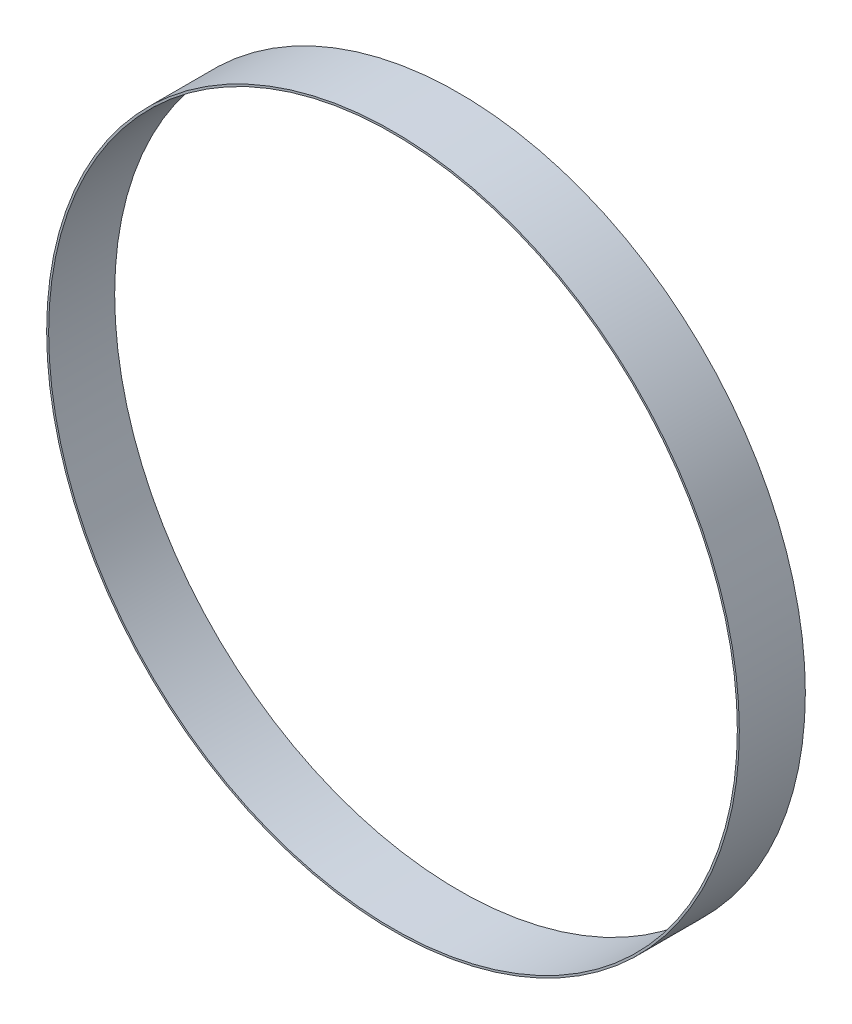
ISO-10303-21;
HEADER;
FILE_DESCRIPTION(('STEP AP214'),'2;1');
FILE_NAME('part.step','',(''),(''),'','','');
FILE_SCHEMA(('AUTOMOTIVE_DESIGN { 1 0 10303 214 1 1 1 1 }'));
ENDSEC;
DATA;
#1=APPLICATION_CONTEXT('core data for automotive mechanical design processes');
#2=APPLICATION_PROTOCOL_DEFINITION('international standard','automotive_design',2000,#1);
#3=PRODUCT_CONTEXT('',#1,'mechanical');
#4=PRODUCT('Part','Part','',(#3));
#5=PRODUCT_RELATED_PRODUCT_CATEGORY('part','',(#4));
#6=PRODUCT_DEFINITION_FORMATION('','',#4);
#7=PRODUCT_DEFINITION_CONTEXT('part definition',#1,'design');
#8=PRODUCT_DEFINITION('design','',#6,#7);
#9=PRODUCT_DEFINITION_SHAPE('','',#8);
#10=(LENGTH_UNIT() NAMED_UNIT(*) SI_UNIT(.MILLI.,.METRE.));
#11=(NAMED_UNIT(*) PLANE_ANGLE_UNIT() SI_UNIT($,.RADIAN.));
#12=(NAMED_UNIT(*) SI_UNIT($,.STERADIAN.) SOLID_ANGLE_UNIT());
#13=UNCERTAINTY_MEASURE_WITH_UNIT(LENGTH_MEASURE(1.E-05),#10,'distance_accuracy_value','');
#14=(GEOMETRIC_REPRESENTATION_CONTEXT(3) GLOBAL_UNCERTAINTY_ASSIGNED_CONTEXT((#13)) GLOBAL_UNIT_ASSIGNED_CONTEXT((#10,
#11,#12)) REPRESENTATION_CONTEXT('',''));
#15=CARTESIAN_POINT('',(0.,0.,0.));
#16=DIRECTION('',(0.,0.,1.));
#17=DIRECTION('',(1.,0.,0.));
#18=AXIS2_PLACEMENT_3D('',#15,#16,#17);
#19=CARTESIAN_POINT('',(0.,0.,100.));
#20=DIRECTION('',(0.,0.,1.));
#21=DIRECTION('',(1.,0.,0.));
#22=AXIS2_PLACEMENT_3D('',#19,#20,#21);
#23=PLANE('',#22);
#24=CARTESIAN_POINT('',(0.,0.,100.));
#25=DIRECTION('',(0.,0.,1.));
#26=DIRECTION('',(1.,0.,0.));
#27=AXIS2_PLACEMENT_3D('',#24,#25,#26);
#28=CIRCLE('',#27,524.5);
#29=CARTESIAN_POINT('',(524.5,0.,100.));
#30=VERTEX_POINT('',#29);
#31=EDGE_CURVE('E10',#30,#30,#28,.T.);
#32=ORIENTED_EDGE('',*,*,#31,.T.);
#33=EDGE_LOOP('',(#32));
#34=FACE_BOUND('',#33,.T.);
#35=CARTESIAN_POINT('',(0.,0.,100.));
#36=DIRECTION('',(0.,0.,1.));
#37=DIRECTION('',(1.,0.,0.));
#38=AXIS2_PLACEMENT_3D('',#35,#36,#37);
#39=CIRCLE('',#38,521.5);
#40=CARTESIAN_POINT('',(521.5,0.,100.));
#41=VERTEX_POINT('',#40);
#42=EDGE_CURVE('E44',#41,#41,#39,.T.);
#43=ORIENTED_EDGE('',*,*,#42,.F.);
#44=EDGE_LOOP('',(#43));
#45=FACE_BOUND('',#44,.T.);
#46=ADVANCED_FACE('F33',(#34,#45),#23,.T.);
#47=CARTESIAN_POINT('',(0.,0.,0.));
#48=DIRECTION('',(0.,0.,1.));
#49=DIRECTION('',(1.,0.,0.));
#50=AXIS2_PLACEMENT_3D('',#47,#48,#49);
#51=PLANE('',#50);
#52=CARTESIAN_POINT('',(0.,0.,0.));
#53=DIRECTION('',(0.,0.,1.));
#54=DIRECTION('',(1.,0.,0.));
#55=AXIS2_PLACEMENT_3D('',#52,#53,#54);
#56=CIRCLE('',#55,524.5);
#57=CARTESIAN_POINT('',(524.5,0.,0.));
#58=VERTEX_POINT('',#57);
#59=EDGE_CURVE('E37',#58,#58,#56,.T.);
#60=ORIENTED_EDGE('',*,*,#59,.F.);
#61=EDGE_LOOP('',(#60));
#62=FACE_BOUND('',#61,.T.);
#63=CARTESIAN_POINT('',(0.,0.,0.));
#64=DIRECTION('',(0.,0.,1.));
#65=DIRECTION('',(1.,0.,0.));
#66=AXIS2_PLACEMENT_3D('',#63,#64,#65);
#67=CIRCLE('',#66,521.5);
#68=CARTESIAN_POINT('',(521.5,0.,0.));
#69=VERTEX_POINT('',#68);
#70=EDGE_CURVE('E46',#69,#69,#67,.T.);
#71=ORIENTED_EDGE('',*,*,#70,.T.);
#72=EDGE_LOOP('',(#71));
#73=FACE_BOUND('',#72,.T.);
#74=ADVANCED_FACE('F56',(#62,#73),#51,.F.);
#75=CARTESIAN_POINT('',(0.,0.,100.));
#76=DIRECTION('',(0.,0.,-1.));
#77=DIRECTION('',(-1.,0.,0.));
#78=AXIS2_PLACEMENT_3D('',#75,#76,#77);
#79=CYLINDRICAL_SURFACE('',#78,524.5);
#80=ORIENTED_EDGE('',*,*,#31,.F.);
#81=EDGE_LOOP('',(#80));
#82=FACE_BOUND('',#81,.T.);
#83=ORIENTED_EDGE('',*,*,#59,.T.);
#84=EDGE_LOOP('',(#83));
#85=FACE_BOUND('',#84,.T.);
#86=ADVANCED_FACE('F35',(#82,#85),#79,.T.);
#87=CARTESIAN_POINT('',(0.,0.,100.));
#88=DIRECTION('',(0.,0.,-1.));
#89=DIRECTION('',(-1.,0.,0.));
#90=AXIS2_PLACEMENT_3D('',#87,#88,#89);
#91=CYLINDRICAL_SURFACE('',#90,521.5);
#92=ORIENTED_EDGE('',*,*,#42,.T.);
#93=EDGE_LOOP('',(#92));
#94=FACE_BOUND('',#93,.T.);
#95=ORIENTED_EDGE('',*,*,#70,.F.);
#96=EDGE_LOOP('',(#95));
#97=FACE_BOUND('',#96,.T.);
#98=ADVANCED_FACE('F52',(#94,#97),#91,.F.);
#99=CLOSED_SHELL('',(#46,#74,#86,#98));
#100=MANIFOLD_SOLID_BREP('B2',#99);
#101=ADVANCED_BREP_SHAPE_REPRESENTATION('',(#18,#100),#14);
#102=SHAPE_DEFINITION_REPRESENTATION(#9,#101);
ENDSEC;
END-ISO-10303-21;
